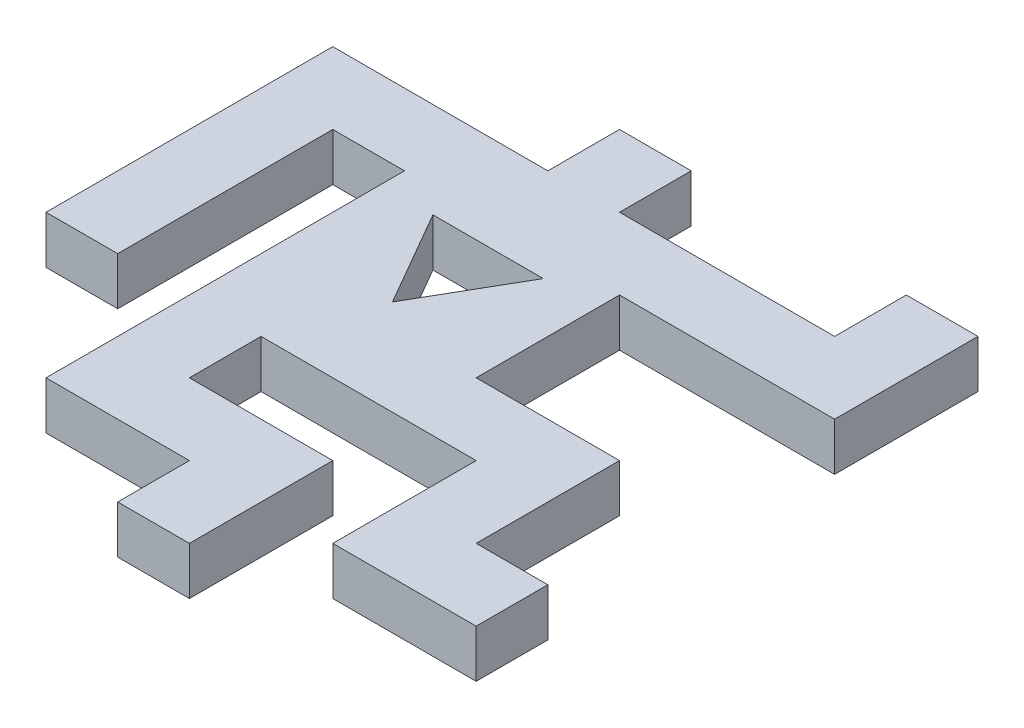
ISO-10303-21;
HEADER;
FILE_DESCRIPTION(('STEP AP214'),'2;1');
FILE_NAME('part.step','',(''),(''),'','','');
FILE_SCHEMA(('AUTOMOTIVE_DESIGN { 1 0 10303 214 1 1 1 1 }'));
ENDSEC;
DATA;
#1=APPLICATION_CONTEXT('core data for automotive mechanical design processes');
#2=APPLICATION_PROTOCOL_DEFINITION('international standard','automotive_design',2000,#1);
#3=PRODUCT_CONTEXT('',#1,'mechanical');
#4=PRODUCT('Part','Part','',(#3));
#5=PRODUCT_RELATED_PRODUCT_CATEGORY('part','',(#4));
#6=PRODUCT_DEFINITION_FORMATION('','',#4);
#7=PRODUCT_DEFINITION_CONTEXT('part definition',#1,'design');
#8=PRODUCT_DEFINITION('design','',#6,#7);
#9=PRODUCT_DEFINITION_SHAPE('','',#8);
#10=(LENGTH_UNIT() NAMED_UNIT(*) SI_UNIT(.MILLI.,.METRE.));
#11=(NAMED_UNIT(*) PLANE_ANGLE_UNIT() SI_UNIT($,.RADIAN.));
#12=(NAMED_UNIT(*) SI_UNIT($,.STERADIAN.) SOLID_ANGLE_UNIT());
#13=UNCERTAINTY_MEASURE_WITH_UNIT(LENGTH_MEASURE(1.E-05),#10,'distance_accuracy_value','');
#14=(GEOMETRIC_REPRESENTATION_CONTEXT(3) GLOBAL_UNCERTAINTY_ASSIGNED_CONTEXT((#13)) GLOBAL_UNIT_ASSIGNED_CONTEXT((#10,
#11,#12)) REPRESENTATION_CONTEXT('',''));
#15=CARTESIAN_POINT('',(0.,0.,0.));
#16=DIRECTION('',(0.,0.,1.));
#17=DIRECTION('',(1.,0.,0.));
#18=AXIS2_PLACEMENT_3D('',#15,#16,#17);
#19=CARTESIAN_POINT('',(-18.75,5.,0.));
#20=DIRECTION('',(-1.,0.,0.));
#21=DIRECTION('',(0.,0.,1.));
#22=AXIS2_PLACEMENT_3D('',#19,#20,#21);
#23=PLANE('',#22);
#24=DIRECTION('',(0.,0.,-1.));
#25=VECTOR('',#24,1.);
#26=CARTESIAN_POINT('',(-18.75,0.,0.));
#27=LINE('',#26,#25);
#28=CARTESIAN_POINT('',(-18.75,0.,15.));
#29=VERTEX_POINT('',#28);
#30=CARTESIAN_POINT('',(-18.75,0.,-7.5));
#31=VERTEX_POINT('',#30);
#32=EDGE_CURVE('E267',#29,#31,#27,.T.);
#33=ORIENTED_EDGE('',*,*,#32,.T.);
#34=DIRECTION('',(0.,-1.,0.));
#35=VECTOR('',#34,1.);
#36=CARTESIAN_POINT('',(-18.75,5.,-7.5));
#37=LINE('',#36,#35);
#38=CARTESIAN_POINT('',(-18.75,5.,-7.5));
#39=VERTEX_POINT('',#38);
#40=EDGE_CURVE('E11',#39,#31,#37,.T.);
#41=ORIENTED_EDGE('',*,*,#40,.F.);
#42=DIRECTION('',(0.,0.,-1.));
#43=VECTOR('',#42,1.);
#44=CARTESIAN_POINT('',(-18.75,5.,0.));
#45=LINE('',#44,#43);
#46=CARTESIAN_POINT('',(-18.75,5.,15.));
#47=VERTEX_POINT('',#46);
#48=EDGE_CURVE('E269',#47,#39,#45,.T.);
#49=ORIENTED_EDGE('',*,*,#48,.F.);
#50=DIRECTION('',(0.,-1.,0.));
#51=VECTOR('',#50,1.);
#52=CARTESIAN_POINT('',(-18.75,5.,15.));
#53=LINE('',#52,#51);
#54=EDGE_CURVE('E341',#47,#29,#53,.T.);
#55=ORIENTED_EDGE('',*,*,#54,.T.);
#56=EDGE_LOOP('',(#33,#41,#49,#55));
#57=FACE_BOUND('',#56,.T.);
#58=ADVANCED_FACE('F39',(#57),#23,.F.);
#59=CARTESIAN_POINT('',(0.,5.,-7.5));
#60=DIRECTION('',(0.,0.,-1.));
#61=DIRECTION('',(-1.,0.,0.));
#62=AXIS2_PLACEMENT_3D('',#59,#60,#61);
#63=PLANE('',#62);
#64=DIRECTION('',(1.,0.,0.));
#65=VECTOR('',#64,1.);
#66=CARTESIAN_POINT('',(0.,0.,-7.5));
#67=LINE('',#66,#65);
#68=CARTESIAN_POINT('',(-11.25,0.,-7.5));
#69=VERTEX_POINT('',#68);
#70=EDGE_CURVE('E344',#31,#69,#67,.T.);
#71=ORIENTED_EDGE('',*,*,#70,.T.);
#72=DIRECTION('',(0.,-1.,0.));
#73=VECTOR('',#72,1.);
#74=CARTESIAN_POINT('',(-11.25,5.,-7.5));
#75=LINE('',#74,#73);
#76=CARTESIAN_POINT('',(-11.25,5.,-7.5));
#77=VERTEX_POINT('',#76);
#78=EDGE_CURVE('E46',#77,#69,#75,.T.);
#79=ORIENTED_EDGE('',*,*,#78,.F.);
#80=DIRECTION('',(1.,0.,0.));
#81=VECTOR('',#80,1.);
#82=CARTESIAN_POINT('',(0.,5.,-7.5));
#83=LINE('',#82,#81);
#84=EDGE_CURVE('E272',#39,#77,#83,.T.);
#85=ORIENTED_EDGE('',*,*,#84,.F.);
#86=ORIENTED_EDGE('',*,*,#40,.T.);
#87=EDGE_LOOP('',(#71,#79,#85,#86));
#88=FACE_BOUND('',#87,.T.);
#89=ADVANCED_FACE('F499',(#88),#63,.F.);
#90=CARTESIAN_POINT('',(-11.25,5.,0.));
#91=DIRECTION('',(1.,0.,0.));
#92=DIRECTION('',(0.,0.,-1.));
#93=AXIS2_PLACEMENT_3D('',#90,#91,#92);
#94=PLANE('',#93);
#95=DIRECTION('',(0.,0.,1.));
#96=VECTOR('',#95,1.);
#97=CARTESIAN_POINT('',(-11.25,0.,0.));
#98=LINE('',#97,#96);
#99=CARTESIAN_POINT('',(-11.25,0.,30.));
#100=VERTEX_POINT('',#99);
#101=EDGE_CURVE('E346',#69,#100,#98,.T.);
#102=ORIENTED_EDGE('',*,*,#101,.T.);
#103=DIRECTION('',(0.,-1.,0.));
#104=VECTOR('',#103,1.);
#105=CARTESIAN_POINT('',(-11.25,5.,30.));
#106=LINE('',#105,#104);
#107=CARTESIAN_POINT('',(-11.25,5.,30.));
#108=VERTEX_POINT('',#107);
#109=EDGE_CURVE('E471',#108,#100,#106,.T.);
#110=ORIENTED_EDGE('',*,*,#109,.F.);
#111=DIRECTION('',(0.,0.,1.));
#112=VECTOR('',#111,1.);
#113=CARTESIAN_POINT('',(-11.25,5.,0.));
#114=LINE('',#113,#112);
#115=EDGE_CURVE('E275',#77,#108,#114,.T.);
#116=ORIENTED_EDGE('',*,*,#115,.F.);
#117=ORIENTED_EDGE('',*,*,#78,.T.);
#118=EDGE_LOOP('',(#102,#110,#116,#117));
#119=FACE_BOUND('',#118,.T.);
#120=ADVANCED_FACE('F478',(#119),#94,.F.);
#121=CARTESIAN_POINT('',(0.,5.,30.));
#122=DIRECTION('',(0.,0.,-1.));
#123=DIRECTION('',(-1.,0.,0.));
#124=AXIS2_PLACEMENT_3D('',#121,#122,#123);
#125=PLANE('',#124);
#126=DIRECTION('',(1.,0.,0.));
#127=VECTOR('',#126,1.);
#128=CARTESIAN_POINT('',(0.,0.,30.));
#129=LINE('',#128,#127);
#130=CARTESIAN_POINT('',(3.75,0.,30.));
#131=VERTEX_POINT('',#130);
#132=EDGE_CURVE('E348',#100,#131,#129,.T.);
#133=ORIENTED_EDGE('',*,*,#132,.T.);
#134=DIRECTION('',(0.,-1.,0.));
#135=VECTOR('',#134,1.);
#136=CARTESIAN_POINT('',(3.75,5.,30.));
#137=LINE('',#136,#135);
#138=CARTESIAN_POINT('',(3.75,5.,30.));
#139=VERTEX_POINT('',#138);
#140=EDGE_CURVE('E468',#139,#131,#137,.T.);
#141=ORIENTED_EDGE('',*,*,#140,.F.);
#142=DIRECTION('',(1.,0.,0.));
#143=VECTOR('',#142,1.);
#144=CARTESIAN_POINT('',(0.,5.,30.));
#145=LINE('',#144,#143);
#146=EDGE_CURVE('E277',#108,#139,#145,.T.);
#147=ORIENTED_EDGE('',*,*,#146,.F.);
#148=ORIENTED_EDGE('',*,*,#109,.T.);
#149=EDGE_LOOP('',(#133,#141,#147,#148));
#150=FACE_BOUND('',#149,.T.);
#151=ADVANCED_FACE('F487',(#150),#125,.F.);
#152=CARTESIAN_POINT('',(3.75,5.,0.));
#153=DIRECTION('',(1.,0.,0.));
#154=DIRECTION('',(0.,0.,-1.));
#155=AXIS2_PLACEMENT_3D('',#152,#153,#154);
#156=PLANE('',#155);
#157=DIRECTION('',(0.,0.,1.));
#158=VECTOR('',#157,1.);
#159=CARTESIAN_POINT('',(3.75,0.,0.));
#160=LINE('',#159,#158);
#161=CARTESIAN_POINT('',(3.75,0.,37.5));
#162=VERTEX_POINT('',#161);
#163=EDGE_CURVE('E350',#131,#162,#160,.T.);
#164=ORIENTED_EDGE('',*,*,#163,.T.);
#165=DIRECTION('',(0.,-1.,0.));
#166=VECTOR('',#165,1.);
#167=CARTESIAN_POINT('',(3.75,5.,37.5));
#168=LINE('',#167,#166);
#169=CARTESIAN_POINT('',(3.75,5.,37.5));
#170=VERTEX_POINT('',#169);
#171=EDGE_CURVE('E465',#170,#162,#168,.T.);
#172=ORIENTED_EDGE('',*,*,#171,.F.);
#173=DIRECTION('',(0.,0.,1.));
#174=VECTOR('',#173,1.);
#175=CARTESIAN_POINT('',(3.75,5.,0.));
#176=LINE('',#175,#174);
#177=EDGE_CURVE('E279',#139,#170,#176,.T.);
#178=ORIENTED_EDGE('',*,*,#177,.F.);
#179=ORIENTED_EDGE('',*,*,#140,.T.);
#180=EDGE_LOOP('',(#164,#172,#178,#179));
#181=FACE_BOUND('',#180,.T.);
#182=ADVANCED_FACE('F491',(#181),#156,.F.);
#183=CARTESIAN_POINT('',(0.,5.,37.5));
#184=DIRECTION('',(0.,0.,-1.));
#185=DIRECTION('',(-1.,0.,0.));
#186=AXIS2_PLACEMENT_3D('',#183,#184,#185);
#187=PLANE('',#186);
#188=DIRECTION('',(1.,0.,0.));
#189=VECTOR('',#188,1.);
#190=CARTESIAN_POINT('',(0.,0.,37.5));
#191=LINE('',#190,#189);
#192=CARTESIAN_POINT('',(11.25,0.,37.5));
#193=VERTEX_POINT('',#192);
#194=EDGE_CURVE('E352',#162,#193,#191,.T.);
#195=ORIENTED_EDGE('',*,*,#194,.T.);
#196=DIRECTION('',(0.,-1.,0.));
#197=VECTOR('',#196,1.);
#198=CARTESIAN_POINT('',(11.25,5.,37.5));
#199=LINE('',#198,#197);
#200=CARTESIAN_POINT('',(11.25,5.,37.5));
#201=VERTEX_POINT('',#200);
#202=EDGE_CURVE('E462',#201,#193,#199,.T.);
#203=ORIENTED_EDGE('',*,*,#202,.F.);
#204=DIRECTION('',(1.,0.,0.));
#205=VECTOR('',#204,1.);
#206=CARTESIAN_POINT('',(0.,5.,37.5));
#207=LINE('',#206,#205);
#208=EDGE_CURVE('E281',#170,#201,#207,.T.);
#209=ORIENTED_EDGE('',*,*,#208,.F.);
#210=ORIENTED_EDGE('',*,*,#171,.T.);
#211=EDGE_LOOP('',(#195,#203,#209,#210));
#212=FACE_BOUND('',#211,.T.);
#213=ADVANCED_FACE('F597',(#212),#187,.F.);
#214=CARTESIAN_POINT('',(11.25,5.,0.));
#215=DIRECTION('',(-1.,0.,0.));
#216=DIRECTION('',(0.,0.,1.));
#217=AXIS2_PLACEMENT_3D('',#214,#215,#216);
#218=PLANE('',#217);
#219=DIRECTION('',(0.,0.,-1.));
#220=VECTOR('',#219,1.);
#221=CARTESIAN_POINT('',(11.25,0.,0.));
#222=LINE('',#221,#220);
#223=CARTESIAN_POINT('',(11.25,0.,22.5));
#224=VERTEX_POINT('',#223);
#225=EDGE_CURVE('E354',#193,#224,#222,.T.);
#226=ORIENTED_EDGE('',*,*,#225,.T.);
#227=DIRECTION('',(0.,-1.,0.));
#228=VECTOR('',#227,1.);
#229=CARTESIAN_POINT('',(11.25,5.,22.5));
#230=LINE('',#229,#228);
#231=CARTESIAN_POINT('',(11.25,5.,22.5));
#232=VERTEX_POINT('',#231);
#233=EDGE_CURVE('E459',#232,#224,#230,.T.);
#234=ORIENTED_EDGE('',*,*,#233,.F.);
#235=DIRECTION('',(0.,0.,-1.));
#236=VECTOR('',#235,1.);
#237=CARTESIAN_POINT('',(11.25,5.,0.));
#238=LINE('',#237,#236);
#239=EDGE_CURVE('E283',#201,#232,#238,.T.);
#240=ORIENTED_EDGE('',*,*,#239,.F.);
#241=ORIENTED_EDGE('',*,*,#202,.T.);
#242=EDGE_LOOP('',(#226,#234,#240,#241));
#243=FACE_BOUND('',#242,.T.);
#244=ADVANCED_FACE('F595',(#243),#218,.F.);
#245=CARTESIAN_POINT('',(0.,5.,22.5));
#246=DIRECTION('',(0.,0.,1.));
#247=DIRECTION('',(1.,0.,0.));
#248=AXIS2_PLACEMENT_3D('',#245,#246,#247);
#249=PLANE('',#248);
#250=DIRECTION('',(-1.,0.,0.));
#251=VECTOR('',#250,1.);
#252=CARTESIAN_POINT('',(0.,0.,22.5));
#253=LINE('',#252,#251);
#254=CARTESIAN_POINT('',(-3.75,0.,22.5));
#255=VERTEX_POINT('',#254);
#256=EDGE_CURVE('E356',#224,#255,#253,.T.);
#257=ORIENTED_EDGE('',*,*,#256,.T.);
#258=DIRECTION('',(0.,-1.,0.));
#259=VECTOR('',#258,1.);
#260=CARTESIAN_POINT('',(-3.75,5.,22.5));
#261=LINE('',#260,#259);
#262=CARTESIAN_POINT('',(-3.75,5.,22.5));
#263=VERTEX_POINT('',#262);
#264=EDGE_CURVE('E456',#263,#255,#261,.T.);
#265=ORIENTED_EDGE('',*,*,#264,.F.);
#266=DIRECTION('',(-1.,0.,0.));
#267=VECTOR('',#266,1.);
#268=CARTESIAN_POINT('',(0.,5.,22.5));
#269=LINE('',#268,#267);
#270=EDGE_CURVE('E285',#232,#263,#269,.T.);
#271=ORIENTED_EDGE('',*,*,#270,.F.);
#272=ORIENTED_EDGE('',*,*,#233,.T.);
#273=EDGE_LOOP('',(#257,#265,#271,#272));
#274=FACE_BOUND('',#273,.T.);
#275=ADVANCED_FACE('F590',(#274),#249,.F.);
#276=CARTESIAN_POINT('',(-3.75,5.,0.));
#277=DIRECTION('',(-1.,0.,0.));
#278=DIRECTION('',(0.,0.,1.));
#279=AXIS2_PLACEMENT_3D('',#276,#277,#278);
#280=PLANE('',#279);
#281=DIRECTION('',(0.,0.,-1.));
#282=VECTOR('',#281,1.);
#283=CARTESIAN_POINT('',(-3.75,0.,0.));
#284=LINE('',#283,#282);
#285=CARTESIAN_POINT('',(-3.75,0.,15.));
#286=VERTEX_POINT('',#285);
#287=EDGE_CURVE('E358',#255,#286,#284,.T.);
#288=ORIENTED_EDGE('',*,*,#287,.T.);
#289=DIRECTION('',(0.,-1.,0.));
#290=VECTOR('',#289,1.);
#291=CARTESIAN_POINT('',(-3.75,5.,15.));
#292=LINE('',#291,#290);
#293=CARTESIAN_POINT('',(-3.75,5.,15.));
#294=VERTEX_POINT('',#293);
#295=EDGE_CURVE('E453',#294,#286,#292,.T.);
#296=ORIENTED_EDGE('',*,*,#295,.F.);
#297=DIRECTION('',(0.,0.,-1.));
#298=VECTOR('',#297,1.);
#299=CARTESIAN_POINT('',(-3.75,5.,0.));
#300=LINE('',#299,#298);
#301=EDGE_CURVE('E287',#263,#294,#300,.T.);
#302=ORIENTED_EDGE('',*,*,#301,.F.);
#303=ORIENTED_EDGE('',*,*,#264,.T.);
#304=EDGE_LOOP('',(#288,#296,#302,#303));
#305=FACE_BOUND('',#304,.T.);
#306=ADVANCED_FACE('F585',(#305),#280,.F.);
#307=CARTESIAN_POINT('',(0.,5.,15.));
#308=DIRECTION('',(0.,0.,-1.));
#309=DIRECTION('',(-1.,0.,0.));
#310=AXIS2_PLACEMENT_3D('',#307,#308,#309);
#311=PLANE('',#310);
#312=DIRECTION('',(1.,0.,0.));
#313=VECTOR('',#312,1.);
#314=CARTESIAN_POINT('',(0.,0.,15.));
#315=LINE('',#314,#313);
#316=CARTESIAN_POINT('',(18.75,0.,15.));
#317=VERTEX_POINT('',#316);
#318=EDGE_CURVE('E360',#286,#317,#315,.T.);
#319=ORIENTED_EDGE('',*,*,#318,.T.);
#320=DIRECTION('',(0.,-1.,0.));
#321=VECTOR('',#320,1.);
#322=CARTESIAN_POINT('',(18.75,5.,15.));
#323=LINE('',#322,#321);
#324=CARTESIAN_POINT('',(18.75,5.,15.));
#325=VERTEX_POINT('',#324);
#326=EDGE_CURVE('E451',#325,#317,#323,.T.);
#327=ORIENTED_EDGE('',*,*,#326,.F.);
#328=DIRECTION('',(1.,0.,0.));
#329=VECTOR('',#328,1.);
#330=CARTESIAN_POINT('',(0.,5.,15.));
#331=LINE('',#330,#329);
#332=EDGE_CURVE('E289',#294,#325,#331,.T.);
#333=ORIENTED_EDGE('',*,*,#332,.F.);
#334=ORIENTED_EDGE('',*,*,#295,.T.);
#335=EDGE_LOOP('',(#319,#327,#333,#334));
#336=FACE_BOUND('',#335,.T.);
#337=ADVANCED_FACE('F581',(#336),#311,.F.);
#338=CARTESIAN_POINT('',(18.75,5.,0.));
#339=DIRECTION('',(-1.,0.,0.));
#340=DIRECTION('',(0.,0.,1.));
#341=AXIS2_PLACEMENT_3D('',#338,#339,#340);
#342=PLANE('',#341);
#343=DIRECTION('',(0.,0.,-1.));
#344=VECTOR('',#343,1.);
#345=CARTESIAN_POINT('',(18.75,0.,0.));
#346=LINE('',#345,#344);
#347=CARTESIAN_POINT('',(18.75,0.,30.));
#348=VERTEX_POINT('',#347);
#349=EDGE_CURVE('E363',#348,#317,#346,.T.);
#350=ORIENTED_EDGE('',*,*,#349,.F.);
#351=DIRECTION('',(0.,-1.,0.));
#352=VECTOR('',#351,1.);
#353=CARTESIAN_POINT('',(18.75,5.,30.));
#354=LINE('',#353,#352);
#355=CARTESIAN_POINT('',(18.75,5.,30.));
#356=VERTEX_POINT('',#355);
#357=EDGE_CURVE('E449',#356,#348,#354,.T.);
#358=ORIENTED_EDGE('',*,*,#357,.F.);
#359=DIRECTION('',(0.,0.,-1.));
#360=VECTOR('',#359,1.);
#361=CARTESIAN_POINT('',(18.75,5.,0.));
#362=LINE('',#361,#360);
#363=EDGE_CURVE('E291',#356,#325,#362,.T.);
#364=ORIENTED_EDGE('',*,*,#363,.T.);
#365=ORIENTED_EDGE('',*,*,#326,.T.);
#366=EDGE_LOOP('',(#350,#358,#364,#365));
#367=FACE_BOUND('',#366,.T.);
#368=ADVANCED_FACE('F576',(#367),#342,.T.);
#369=CARTESIAN_POINT('',(0.,5.,30.));
#370=DIRECTION('',(0.,0.,1.));
#371=DIRECTION('',(1.,0.,0.));
#372=AXIS2_PLACEMENT_3D('',#369,#370,#371);
#373=PLANE('',#372);
#374=DIRECTION('',(-1.,0.,0.));
#375=VECTOR('',#374,1.);
#376=CARTESIAN_POINT('',(0.,0.,30.));
#377=LINE('',#376,#375);
#378=CARTESIAN_POINT('',(33.75,0.,30.));
#379=VERTEX_POINT('',#378);
#380=EDGE_CURVE('E366',#379,#348,#377,.T.);
#381=ORIENTED_EDGE('',*,*,#380,.F.);
#382=DIRECTION('',(0.,-1.,0.));
#383=VECTOR('',#382,1.);
#384=CARTESIAN_POINT('',(33.75,5.,30.));
#385=LINE('',#384,#383);
#386=CARTESIAN_POINT('',(33.75,5.,30.));
#387=VERTEX_POINT('',#386);
#388=EDGE_CURVE('E447',#387,#379,#385,.T.);
#389=ORIENTED_EDGE('',*,*,#388,.F.);
#390=DIRECTION('',(-1.,0.,0.));
#391=VECTOR('',#390,1.);
#392=CARTESIAN_POINT('',(0.,5.,30.));
#393=LINE('',#392,#391);
#394=EDGE_CURVE('E294',#387,#356,#393,.T.);
#395=ORIENTED_EDGE('',*,*,#394,.T.);
#396=ORIENTED_EDGE('',*,*,#357,.T.);
#397=EDGE_LOOP('',(#381,#389,#395,#396));
#398=FACE_BOUND('',#397,.T.);
#399=ADVANCED_FACE('F571',(#398),#373,.T.);
#400=CARTESIAN_POINT('',(33.75,5.,0.));
#401=DIRECTION('',(1.,0.,0.));
#402=DIRECTION('',(0.,0.,-1.));
#403=AXIS2_PLACEMENT_3D('',#400,#401,#402);
#404=PLANE('',#403);
#405=DIRECTION('',(0.,0.,1.));
#406=VECTOR('',#405,1.);
#407=CARTESIAN_POINT('',(33.75,0.,0.));
#408=LINE('',#407,#406);
#409=CARTESIAN_POINT('',(33.75,0.,22.5));
#410=VERTEX_POINT('',#409);
#411=EDGE_CURVE('E369',#410,#379,#408,.T.);
#412=ORIENTED_EDGE('',*,*,#411,.F.);
#413=DIRECTION('',(0.,-1.,0.));
#414=VECTOR('',#413,1.);
#415=CARTESIAN_POINT('',(33.75,5.,22.5));
#416=LINE('',#415,#414);
#417=CARTESIAN_POINT('',(33.75,5.,22.5));
#418=VERTEX_POINT('',#417);
#419=EDGE_CURVE('E445',#418,#410,#416,.T.);
#420=ORIENTED_EDGE('',*,*,#419,.F.);
#421=DIRECTION('',(0.,0.,1.));
#422=VECTOR('',#421,1.);
#423=CARTESIAN_POINT('',(33.75,5.,0.));
#424=LINE('',#423,#422);
#425=EDGE_CURVE('E297',#418,#387,#424,.T.);
#426=ORIENTED_EDGE('',*,*,#425,.T.);
#427=ORIENTED_EDGE('',*,*,#388,.T.);
#428=EDGE_LOOP('',(#412,#420,#426,#427));
#429=FACE_BOUND('',#428,.T.);
#430=ADVANCED_FACE('F567',(#429),#404,.T.);
#431=CARTESIAN_POINT('',(0.,5.,22.5));
#432=DIRECTION('',(0.,0.,-1.));
#433=DIRECTION('',(-1.,0.,0.));
#434=AXIS2_PLACEMENT_3D('',#431,#432,#433);
#435=PLANE('',#434);
#436=DIRECTION('',(1.,0.,0.));
#437=VECTOR('',#436,1.);
#438=CARTESIAN_POINT('',(0.,0.,22.5));
#439=LINE('',#438,#437);
#440=CARTESIAN_POINT('',(26.25,0.,22.5));
#441=VERTEX_POINT('',#440);
#442=EDGE_CURVE('E372',#441,#410,#439,.T.);
#443=ORIENTED_EDGE('',*,*,#442,.F.);
#444=DIRECTION('',(0.,-1.,0.));
#445=VECTOR('',#444,1.);
#446=CARTESIAN_POINT('',(26.25,5.,22.5));
#447=LINE('',#446,#445);
#448=CARTESIAN_POINT('',(26.25,5.,22.5));
#449=VERTEX_POINT('',#448);
#450=EDGE_CURVE('E443',#449,#441,#447,.T.);
#451=ORIENTED_EDGE('',*,*,#450,.F.);
#452=DIRECTION('',(1.,0.,0.));
#453=VECTOR('',#452,1.);
#454=CARTESIAN_POINT('',(0.,5.,22.5));
#455=LINE('',#454,#453);
#456=EDGE_CURVE('E300',#449,#418,#455,.T.);
#457=ORIENTED_EDGE('',*,*,#456,.T.);
#458=ORIENTED_EDGE('',*,*,#419,.T.);
#459=EDGE_LOOP('',(#443,#451,#457,#458));
#460=FACE_BOUND('',#459,.T.);
#461=ADVANCED_FACE('F563',(#460),#435,.T.);
#462=CARTESIAN_POINT('',(26.25,5.,0.));
#463=DIRECTION('',(1.,0.,0.));
#464=DIRECTION('',(0.,0.,-1.));
#465=AXIS2_PLACEMENT_3D('',#462,#463,#464);
#466=PLANE('',#465);
#467=DIRECTION('',(0.,0.,1.));
#468=VECTOR('',#467,1.);
#469=CARTESIAN_POINT('',(26.25,0.,0.));
#470=LINE('',#469,#468);
#471=CARTESIAN_POINT('',(26.25,0.,7.49999999999999));
#472=VERTEX_POINT('',#471);
#473=EDGE_CURVE('E375',#472,#441,#470,.T.);
#474=ORIENTED_EDGE('',*,*,#473,.F.);
#475=DIRECTION('',(0.,-1.,0.));
#476=VECTOR('',#475,1.);
#477=CARTESIAN_POINT('',(26.25,5.,7.49999999999999));
#478=LINE('',#477,#476);
#479=CARTESIAN_POINT('',(26.25,5.,7.49999999999999));
#480=VERTEX_POINT('',#479);
#481=EDGE_CURVE('E441',#480,#472,#478,.T.);
#482=ORIENTED_EDGE('',*,*,#481,.F.);
#483=DIRECTION('',(0.,0.,1.));
#484=VECTOR('',#483,1.);
#485=CARTESIAN_POINT('',(26.25,5.,0.));
#486=LINE('',#485,#484);
#487=EDGE_CURVE('E303',#480,#449,#486,.T.);
#488=ORIENTED_EDGE('',*,*,#487,.T.);
#489=ORIENTED_EDGE('',*,*,#450,.T.);
#490=EDGE_LOOP('',(#474,#482,#488,#489));
#491=FACE_BOUND('',#490,.T.);
#492=ADVANCED_FACE('F559',(#491),#466,.T.);
#493=CARTESIAN_POINT('',(0.,5.,7.49999999999999));
#494=DIRECTION('',(0.,0.,-1.));
#495=DIRECTION('',(-1.,0.,0.));
#496=AXIS2_PLACEMENT_3D('',#493,#494,#495);
#497=PLANE('',#496);
#498=DIRECTION('',(1.,0.,0.));
#499=VECTOR('',#498,1.);
#500=CARTESIAN_POINT('',(0.,0.,7.49999999999999));
#501=LINE('',#500,#499);
#502=CARTESIAN_POINT('',(11.25,0.,7.49999999999999));
#503=VERTEX_POINT('',#502);
#504=EDGE_CURVE('E378',#503,#472,#501,.T.);
#505=ORIENTED_EDGE('',*,*,#504,.F.);
#506=DIRECTION('',(0.,-1.,0.));
#507=VECTOR('',#506,1.);
#508=CARTESIAN_POINT('',(11.25,5.,7.49999999999999));
#509=LINE('',#508,#507);
#510=CARTESIAN_POINT('',(11.25,5.,7.49999999999999));
#511=VERTEX_POINT('',#510);
#512=EDGE_CURVE('E439',#511,#503,#509,.T.);
#513=ORIENTED_EDGE('',*,*,#512,.F.);
#514=DIRECTION('',(1.,0.,0.));
#515=VECTOR('',#514,1.);
#516=CARTESIAN_POINT('',(0.,5.,7.49999999999999));
#517=LINE('',#516,#515);
#518=EDGE_CURVE('E306',#511,#480,#517,.T.);
#519=ORIENTED_EDGE('',*,*,#518,.T.);
#520=ORIENTED_EDGE('',*,*,#481,.T.);
#521=EDGE_LOOP('',(#505,#513,#519,#520));
#522=FACE_BOUND('',#521,.T.);
#523=ADVANCED_FACE('F555',(#522),#497,.T.);
#524=CARTESIAN_POINT('',(11.25,5.,0.));
#525=DIRECTION('',(1.,0.,0.));
#526=DIRECTION('',(0.,0.,-1.));
#527=AXIS2_PLACEMENT_3D('',#524,#525,#526);
#528=PLANE('',#527);
#529=DIRECTION('',(0.,0.,1.));
#530=VECTOR('',#529,1.);
#531=CARTESIAN_POINT('',(11.25,0.,0.));
#532=LINE('',#531,#530);
#533=CARTESIAN_POINT('',(11.25,0.,-7.5));
#534=VERTEX_POINT('',#533);
#535=EDGE_CURVE('E381',#534,#503,#532,.T.);
#536=ORIENTED_EDGE('',*,*,#535,.F.);
#537=DIRECTION('',(0.,-1.,0.));
#538=VECTOR('',#537,1.);
#539=CARTESIAN_POINT('',(11.25,5.,-7.5));
#540=LINE('',#539,#538);
#541=CARTESIAN_POINT('',(11.25,5.,-7.5));
#542=VERTEX_POINT('',#541);
#543=EDGE_CURVE('E437',#542,#534,#540,.T.);
#544=ORIENTED_EDGE('',*,*,#543,.F.);
#545=DIRECTION('',(0.,0.,1.));
#546=VECTOR('',#545,1.);
#547=CARTESIAN_POINT('',(11.25,5.,0.));
#548=LINE('',#547,#546);
#549=EDGE_CURVE('E309',#542,#511,#548,.T.);
#550=ORIENTED_EDGE('',*,*,#549,.T.);
#551=ORIENTED_EDGE('',*,*,#512,.T.);
#552=EDGE_LOOP('',(#536,#544,#550,#551));
#553=FACE_BOUND('',#552,.T.);
#554=ADVANCED_FACE('F551',(#553),#528,.T.);
#555=CARTESIAN_POINT('',(0.,5.,-7.5));
#556=DIRECTION('',(0.,0.,1.));
#557=DIRECTION('',(1.,0.,0.));
#558=AXIS2_PLACEMENT_3D('',#555,#556,#557);
#559=PLANE('',#558);
#560=DIRECTION('',(-1.,0.,0.));
#561=VECTOR('',#560,1.);
#562=CARTESIAN_POINT('',(0.,0.,-7.5));
#563=LINE('',#562,#561);
#564=CARTESIAN_POINT('',(33.75,0.,-7.5));
#565=VERTEX_POINT('',#564);
#566=EDGE_CURVE('E384',#565,#534,#563,.T.);
#567=ORIENTED_EDGE('',*,*,#566,.F.);
#568=DIRECTION('',(0.,-1.,0.));
#569=VECTOR('',#568,1.);
#570=CARTESIAN_POINT('',(33.75,5.,-7.5));
#571=LINE('',#570,#569);
#572=CARTESIAN_POINT('',(33.75,5.,-7.5));
#573=VERTEX_POINT('',#572);
#574=EDGE_CURVE('E435',#573,#565,#571,.T.);
#575=ORIENTED_EDGE('',*,*,#574,.F.);
#576=DIRECTION('',(-1.,0.,0.));
#577=VECTOR('',#576,1.);
#578=CARTESIAN_POINT('',(0.,5.,-7.5));
#579=LINE('',#578,#577);
#580=EDGE_CURVE('E312',#573,#542,#579,.T.);
#581=ORIENTED_EDGE('',*,*,#580,.T.);
#582=ORIENTED_EDGE('',*,*,#543,.T.);
#583=EDGE_LOOP('',(#567,#575,#581,#582));
#584=FACE_BOUND('',#583,.T.);
#585=ADVANCED_FACE('F547',(#584),#559,.T.);
#586=CARTESIAN_POINT('',(33.75,5.,0.));
#587=DIRECTION('',(1.,0.,0.));
#588=DIRECTION('',(0.,0.,-1.));
#589=AXIS2_PLACEMENT_3D('',#586,#587,#588);
#590=PLANE('',#589);
#591=DIRECTION('',(0.,0.,1.));
#592=VECTOR('',#591,1.);
#593=CARTESIAN_POINT('',(33.75,0.,0.));
#594=LINE('',#593,#592);
#595=CARTESIAN_POINT('',(33.75,0.,-22.5));
#596=VERTEX_POINT('',#595);
#597=EDGE_CURVE('E387',#596,#565,#594,.T.);
#598=ORIENTED_EDGE('',*,*,#597,.F.);
#599=DIRECTION('',(0.,-1.,0.));
#600=VECTOR('',#599,1.);
#601=CARTESIAN_POINT('',(33.75,5.,-22.5));
#602=LINE('',#601,#600);
#603=CARTESIAN_POINT('',(33.75,5.,-22.5));
#604=VERTEX_POINT('',#603);
#605=EDGE_CURVE('E433',#604,#596,#602,.T.);
#606=ORIENTED_EDGE('',*,*,#605,.F.);
#607=DIRECTION('',(0.,0.,1.));
#608=VECTOR('',#607,1.);
#609=CARTESIAN_POINT('',(33.75,5.,0.));
#610=LINE('',#609,#608);
#611=EDGE_CURVE('E315',#604,#573,#610,.T.);
#612=ORIENTED_EDGE('',*,*,#611,.T.);
#613=ORIENTED_EDGE('',*,*,#574,.T.);
#614=EDGE_LOOP('',(#598,#606,#612,#613));
#615=FACE_BOUND('',#614,.T.);
#616=ADVANCED_FACE('F543',(#615),#590,.T.);
#617=CARTESIAN_POINT('',(0.,5.,-22.5));
#618=DIRECTION('',(0.,0.,-1.));
#619=DIRECTION('',(-1.,0.,0.));
#620=AXIS2_PLACEMENT_3D('',#617,#618,#619);
#621=PLANE('',#620);
#622=DIRECTION('',(1.,0.,0.));
#623=VECTOR('',#622,1.);
#624=CARTESIAN_POINT('',(0.,0.,-22.5));
#625=LINE('',#624,#623);
#626=CARTESIAN_POINT('',(26.25,0.,-22.5));
#627=VERTEX_POINT('',#626);
#628=EDGE_CURVE('E390',#627,#596,#625,.T.);
#629=ORIENTED_EDGE('',*,*,#628,.F.);
#630=DIRECTION('',(0.,-1.,0.));
#631=VECTOR('',#630,1.);
#632=CARTESIAN_POINT('',(26.25,5.,-22.5));
#633=LINE('',#632,#631);
#634=CARTESIAN_POINT('',(26.25,5.,-22.5));
#635=VERTEX_POINT('',#634);
#636=EDGE_CURVE('E431',#635,#627,#633,.T.);
#637=ORIENTED_EDGE('',*,*,#636,.F.);
#638=DIRECTION('',(1.,0.,0.));
#639=VECTOR('',#638,1.);
#640=CARTESIAN_POINT('',(0.,5.,-22.5));
#641=LINE('',#640,#639);
#642=EDGE_CURVE('E318',#635,#604,#641,.T.);
#643=ORIENTED_EDGE('',*,*,#642,.T.);
#644=ORIENTED_EDGE('',*,*,#605,.T.);
#645=EDGE_LOOP('',(#629,#637,#643,#644));
#646=FACE_BOUND('',#645,.T.);
#647=ADVANCED_FACE('F539',(#646),#621,.T.);
#648=CARTESIAN_POINT('',(26.25,5.,0.));
#649=DIRECTION('',(-1.,0.,0.));
#650=DIRECTION('',(0.,0.,1.));
#651=AXIS2_PLACEMENT_3D('',#648,#649,#650);
#652=PLANE('',#651);
#653=DIRECTION('',(0.,0.,-1.));
#654=VECTOR('',#653,1.);
#655=CARTESIAN_POINT('',(26.25,0.,0.));
#656=LINE('',#655,#654);
#657=CARTESIAN_POINT('',(26.25,0.,-15.));
#658=VERTEX_POINT('',#657);
#659=EDGE_CURVE('E393',#658,#627,#656,.T.);
#660=ORIENTED_EDGE('',*,*,#659,.F.);
#661=DIRECTION('',(0.,-1.,0.));
#662=VECTOR('',#661,1.);
#663=CARTESIAN_POINT('',(26.25,5.,-15.));
#664=LINE('',#663,#662);
#665=CARTESIAN_POINT('',(26.25,5.,-15.));
#666=VERTEX_POINT('',#665);
#667=EDGE_CURVE('E429',#666,#658,#664,.T.);
#668=ORIENTED_EDGE('',*,*,#667,.F.);
#669=DIRECTION('',(0.,0.,-1.));
#670=VECTOR('',#669,1.);
#671=CARTESIAN_POINT('',(26.25,5.,0.));
#672=LINE('',#671,#670);
#673=EDGE_CURVE('E321',#666,#635,#672,.T.);
#674=ORIENTED_EDGE('',*,*,#673,.T.);
#675=ORIENTED_EDGE('',*,*,#636,.T.);
#676=EDGE_LOOP('',(#660,#668,#674,#675));
#677=FACE_BOUND('',#676,.T.);
#678=ADVANCED_FACE('F535',(#677),#652,.T.);
#679=CARTESIAN_POINT('',(0.,5.,-15.));
#680=DIRECTION('',(0.,0.,-1.));
#681=DIRECTION('',(-1.,0.,0.));
#682=AXIS2_PLACEMENT_3D('',#679,#680,#681);
#683=PLANE('',#682);
#684=DIRECTION('',(1.,0.,0.));
#685=VECTOR('',#684,1.);
#686=CARTESIAN_POINT('',(0.,0.,-15.));
#687=LINE('',#686,#685);
#688=CARTESIAN_POINT('',(3.75,0.,-15.));
#689=VERTEX_POINT('',#688);
#690=EDGE_CURVE('E396',#689,#658,#687,.T.);
#691=ORIENTED_EDGE('',*,*,#690,.F.);
#692=DIRECTION('',(0.,-1.,0.));
#693=VECTOR('',#692,1.);
#694=CARTESIAN_POINT('',(3.75,5.,-15.));
#695=LINE('',#694,#693);
#696=CARTESIAN_POINT('',(3.75,5.,-15.));
#697=VERTEX_POINT('',#696);
#698=EDGE_CURVE('E427',#697,#689,#695,.T.);
#699=ORIENTED_EDGE('',*,*,#698,.F.);
#700=DIRECTION('',(1.,0.,0.));
#701=VECTOR('',#700,1.);
#702=CARTESIAN_POINT('',(0.,5.,-15.));
#703=LINE('',#702,#701);
#704=EDGE_CURVE('E324',#697,#666,#703,.T.);
#705=ORIENTED_EDGE('',*,*,#704,.T.);
#706=ORIENTED_EDGE('',*,*,#667,.T.);
#707=EDGE_LOOP('',(#691,#699,#705,#706));
#708=FACE_BOUND('',#707,.T.);
#709=ADVANCED_FACE('F529',(#708),#683,.T.);
#710=CARTESIAN_POINT('',(3.75,5.,0.));
#711=DIRECTION('',(-1.,0.,0.));
#712=DIRECTION('',(0.,0.,1.));
#713=AXIS2_PLACEMENT_3D('',#710,#711,#712);
#714=PLANE('',#713);
#715=DIRECTION('',(0.,0.,-1.));
#716=VECTOR('',#715,1.);
#717=CARTESIAN_POINT('',(3.75,0.,0.));
#718=LINE('',#717,#716);
#719=CARTESIAN_POINT('',(3.75,0.,-22.5));
#720=VERTEX_POINT('',#719);
#721=EDGE_CURVE('E399',#689,#720,#718,.T.);
#722=ORIENTED_EDGE('',*,*,#721,.T.);
#723=DIRECTION('',(0.,-1.,0.));
#724=VECTOR('',#723,1.);
#725=CARTESIAN_POINT('',(3.75,5.,-22.5));
#726=LINE('',#725,#724);
#727=CARTESIAN_POINT('',(3.75,5.,-22.5));
#728=VERTEX_POINT('',#727);
#729=EDGE_CURVE('E425',#728,#720,#726,.T.);
#730=ORIENTED_EDGE('',*,*,#729,.F.);
#731=DIRECTION('',(0.,0.,-1.));
#732=VECTOR('',#731,1.);
#733=CARTESIAN_POINT('',(3.75,5.,0.));
#734=LINE('',#733,#732);
#735=EDGE_CURVE('E327',#697,#728,#734,.T.);
#736=ORIENTED_EDGE('',*,*,#735,.F.);
#737=ORIENTED_EDGE('',*,*,#698,.T.);
#738=EDGE_LOOP('',(#722,#730,#736,#737));
#739=FACE_BOUND('',#738,.T.);
#740=ADVANCED_FACE('F757',(#739),#714,.F.);
#741=CARTESIAN_POINT('',(0.,5.,-22.5));
#742=DIRECTION('',(0.,0.,-1.));
#743=DIRECTION('',(-1.,0.,0.));
#744=AXIS2_PLACEMENT_3D('',#741,#742,#743);
#745=PLANE('',#744);
#746=DIRECTION('',(1.,0.,0.));
#747=VECTOR('',#746,1.);
#748=CARTESIAN_POINT('',(0.,0.,-22.5));
#749=LINE('',#748,#747);
#750=CARTESIAN_POINT('',(-3.75,0.,-22.5));
#751=VERTEX_POINT('',#750);
#752=EDGE_CURVE('E402',#751,#720,#749,.T.);
#753=ORIENTED_EDGE('',*,*,#752,.F.);
#754=DIRECTION('',(0.,-1.,0.));
#755=VECTOR('',#754,1.);
#756=CARTESIAN_POINT('',(-3.75,5.,-22.5));
#757=LINE('',#756,#755);
#758=CARTESIAN_POINT('',(-3.75,5.,-22.5));
#759=VERTEX_POINT('',#758);
#760=EDGE_CURVE('E423',#759,#751,#757,.T.);
#761=ORIENTED_EDGE('',*,*,#760,.F.);
#762=DIRECTION('',(1.,0.,0.));
#763=VECTOR('',#762,1.);
#764=CARTESIAN_POINT('',(0.,5.,-22.5));
#765=LINE('',#764,#763);
#766=EDGE_CURVE('E329',#759,#728,#765,.T.);
#767=ORIENTED_EDGE('',*,*,#766,.T.);
#768=ORIENTED_EDGE('',*,*,#729,.T.);
#769=EDGE_LOOP('',(#753,#761,#767,#768));
#770=FACE_BOUND('',#769,.T.);
#771=ADVANCED_FACE('F523',(#770),#745,.T.);
#772=CARTESIAN_POINT('',(-3.75000000000001,5.,0.));
#773=DIRECTION('',(-1.,0.,0.));
#774=DIRECTION('',(0.,0.,1.));
#775=AXIS2_PLACEMENT_3D('',#772,#773,#774);
#776=PLANE('',#775);
#777=DIRECTION('',(0.,0.,-1.));
#778=VECTOR('',#777,1.);
#779=CARTESIAN_POINT('',(-3.75000000000001,0.,0.));
#780=LINE('',#779,#778);
#781=CARTESIAN_POINT('',(-3.75,0.,-15.));
#782=VERTEX_POINT('',#781);
#783=EDGE_CURVE('E405',#782,#751,#780,.T.);
#784=ORIENTED_EDGE('',*,*,#783,.F.);
#785=DIRECTION('',(0.,-1.,0.));
#786=VECTOR('',#785,1.);
#787=CARTESIAN_POINT('',(-3.75,5.,-15.));
#788=LINE('',#787,#786);
#789=CARTESIAN_POINT('',(-3.75,5.,-15.));
#790=VERTEX_POINT('',#789);
#791=EDGE_CURVE('E421',#790,#782,#788,.T.);
#792=ORIENTED_EDGE('',*,*,#791,.F.);
#793=DIRECTION('',(0.,0.,-1.));
#794=VECTOR('',#793,1.);
#795=CARTESIAN_POINT('',(-3.75000000000001,5.,0.));
#796=LINE('',#795,#794);
#797=EDGE_CURVE('E332',#790,#759,#796,.T.);
#798=ORIENTED_EDGE('',*,*,#797,.T.);
#799=ORIENTED_EDGE('',*,*,#760,.T.);
#800=EDGE_LOOP('',(#784,#792,#798,#799));
#801=FACE_BOUND('',#800,.T.);
#802=ADVANCED_FACE('F519',(#801),#776,.T.);
#803=CARTESIAN_POINT('',(0.,5.,-15.));
#804=DIRECTION('',(0.,0.,1.));
#805=DIRECTION('',(1.,0.,0.));
#806=AXIS2_PLACEMENT_3D('',#803,#804,#805);
#807=PLANE('',#806);
#808=DIRECTION('',(-1.,0.,0.));
#809=VECTOR('',#808,1.);
#810=CARTESIAN_POINT('',(0.,0.,-15.));
#811=LINE('',#810,#809);
#812=CARTESIAN_POINT('',(-26.25,0.,-15.));
#813=VERTEX_POINT('',#812);
#814=EDGE_CURVE('E408',#782,#813,#811,.T.);
#815=ORIENTED_EDGE('',*,*,#814,.T.);
#816=DIRECTION('',(0.,-1.,0.));
#817=VECTOR('',#816,1.);
#818=CARTESIAN_POINT('',(-26.25,5.,-15.));
#819=LINE('',#818,#817);
#820=CARTESIAN_POINT('',(-26.25,5.,-15.));
#821=VERTEX_POINT('',#820);
#822=EDGE_CURVE('E418',#821,#813,#819,.T.);
#823=ORIENTED_EDGE('',*,*,#822,.F.);
#824=DIRECTION('',(-1.,0.,0.));
#825=VECTOR('',#824,1.);
#826=CARTESIAN_POINT('',(0.,5.,-15.));
#827=LINE('',#826,#825);
#828=EDGE_CURVE('E335',#790,#821,#827,.T.);
#829=ORIENTED_EDGE('',*,*,#828,.F.);
#830=ORIENTED_EDGE('',*,*,#791,.T.);
#831=EDGE_LOOP('',(#815,#823,#829,#830));
#832=FACE_BOUND('',#831,.T.);
#833=ADVANCED_FACE('F515',(#832),#807,.F.);
#834=CARTESIAN_POINT('',(-26.25,5.,0.));
#835=DIRECTION('',(1.,0.,0.));
#836=DIRECTION('',(0.,0.,-1.));
#837=AXIS2_PLACEMENT_3D('',#834,#835,#836);
#838=PLANE('',#837);
#839=DIRECTION('',(0.,0.,1.));
#840=VECTOR('',#839,1.);
#841=CARTESIAN_POINT('',(-26.25,0.,0.));
#842=LINE('',#841,#840);
#843=CARTESIAN_POINT('',(-26.25,0.,15.));
#844=VERTEX_POINT('',#843);
#845=EDGE_CURVE('E410',#813,#844,#842,.T.);
#846=ORIENTED_EDGE('',*,*,#845,.T.);
#847=DIRECTION('',(0.,-1.,0.));
#848=VECTOR('',#847,1.);
#849=CARTESIAN_POINT('',(-26.25,5.,15.));
#850=LINE('',#849,#848);
#851=CARTESIAN_POINT('',(-26.25,5.,15.));
#852=VERTEX_POINT('',#851);
#853=EDGE_CURVE('E415',#852,#844,#850,.T.);
#854=ORIENTED_EDGE('',*,*,#853,.F.);
#855=DIRECTION('',(0.,0.,1.));
#856=VECTOR('',#855,1.);
#857=CARTESIAN_POINT('',(-26.25,5.,0.));
#858=LINE('',#857,#856);
#859=EDGE_CURVE('E337',#821,#852,#858,.T.);
#860=ORIENTED_EDGE('',*,*,#859,.F.);
#861=ORIENTED_EDGE('',*,*,#822,.T.);
#862=EDGE_LOOP('',(#846,#854,#860,#861));
#863=FACE_BOUND('',#862,.T.);
#864=ADVANCED_FACE('F511',(#863),#838,.F.);
#865=CARTESIAN_POINT('',(0.,5.,15.));
#866=DIRECTION('',(0.,0.,-1.));
#867=DIRECTION('',(-1.,0.,0.));
#868=AXIS2_PLACEMENT_3D('',#865,#866,#867);
#869=PLANE('',#868);
#870=DIRECTION('',(1.,0.,0.));
#871=VECTOR('',#870,1.);
#872=CARTESIAN_POINT('',(0.,0.,15.));
#873=LINE('',#872,#871);
#874=EDGE_CURVE('E273',#844,#29,#873,.T.);
#875=ORIENTED_EDGE('',*,*,#874,.T.);
#876=ORIENTED_EDGE('',*,*,#54,.F.);
#877=DIRECTION('',(1.,0.,0.));
#878=VECTOR('',#877,1.);
#879=CARTESIAN_POINT('',(0.,5.,15.));
#880=LINE('',#879,#878);
#881=EDGE_CURVE('E339',#852,#47,#880,.T.);
#882=ORIENTED_EDGE('',*,*,#881,.F.);
#883=ORIENTED_EDGE('',*,*,#853,.T.);
#884=EDGE_LOOP('',(#875,#876,#882,#883));
#885=FACE_BOUND('',#884,.T.);
#886=ADVANCED_FACE('F506',(#885),#869,.F.);
#887=CARTESIAN_POINT('',(0.,5.,0.));
#888=DIRECTION('',(0.,1.,0.));
#889=DIRECTION('',(0.,0.,1.));
#890=AXIS2_PLACEMENT_3D('',#887,#888,#889);
#891=PLANE('',#890);
#892=DIRECTION('',(0.5,0.,0.866025403784439));
#893=VECTOR('',#892,1.);
#894=CARTESIAN_POINT('',(0.,5.,4.99999999999999));
#895=LINE('',#894,#893);
#896=CARTESIAN_POINT('',(-5.77350269189625,5.,-5.));
#897=VERTEX_POINT('',#896);
#898=CARTESIAN_POINT('',(0.,5.,4.99999999999999));
#899=VERTEX_POINT('',#898);
#900=EDGE_CURVE('E53',#897,#899,#895,.T.);
#901=ORIENTED_EDGE('',*,*,#900,.F.);
#902=DIRECTION('',(-1.,0.,0.));
#903=VECTOR('',#902,1.);
#904=CARTESIAN_POINT('',(-5.77350269189625,5.,-5.));
#905=LINE('',#904,#903);
#906=CARTESIAN_POINT('',(5.77350269189625,5.,-5.));
#907=VERTEX_POINT('',#906);
#908=EDGE_CURVE('E256',#907,#897,#905,.T.);
#909=ORIENTED_EDGE('',*,*,#908,.F.);
#910=DIRECTION('',(0.5,0.,-0.866025403784439));
#911=VECTOR('',#910,1.);
#912=CARTESIAN_POINT('',(5.77350269189625,5.,-5.));
#913=LINE('',#912,#911);
#914=EDGE_CURVE('E259',#899,#907,#913,.T.);
#915=ORIENTED_EDGE('',*,*,#914,.F.);
#916=EDGE_LOOP('',(#901,#909,#915));
#917=FACE_BOUND('',#916,.T.);
#918=ORIENTED_EDGE('',*,*,#48,.T.);
#919=ORIENTED_EDGE('',*,*,#84,.T.);
#920=ORIENTED_EDGE('',*,*,#115,.T.);
#921=ORIENTED_EDGE('',*,*,#146,.T.);
#922=ORIENTED_EDGE('',*,*,#177,.T.);
#923=ORIENTED_EDGE('',*,*,#208,.T.);
#924=ORIENTED_EDGE('',*,*,#239,.T.);
#925=ORIENTED_EDGE('',*,*,#270,.T.);
#926=ORIENTED_EDGE('',*,*,#301,.T.);
#927=ORIENTED_EDGE('',*,*,#332,.T.);
#928=ORIENTED_EDGE('',*,*,#363,.F.);
#929=ORIENTED_EDGE('',*,*,#394,.F.);
#930=ORIENTED_EDGE('',*,*,#425,.F.);
#931=ORIENTED_EDGE('',*,*,#456,.F.);
#932=ORIENTED_EDGE('',*,*,#487,.F.);
#933=ORIENTED_EDGE('',*,*,#518,.F.);
#934=ORIENTED_EDGE('',*,*,#549,.F.);
#935=ORIENTED_EDGE('',*,*,#580,.F.);
#936=ORIENTED_EDGE('',*,*,#611,.F.);
#937=ORIENTED_EDGE('',*,*,#642,.F.);
#938=ORIENTED_EDGE('',*,*,#673,.F.);
#939=ORIENTED_EDGE('',*,*,#704,.F.);
#940=ORIENTED_EDGE('',*,*,#735,.T.);
#941=ORIENTED_EDGE('',*,*,#766,.F.);
#942=ORIENTED_EDGE('',*,*,#797,.F.);
#943=ORIENTED_EDGE('',*,*,#828,.T.);
#944=ORIENTED_EDGE('',*,*,#859,.T.);
#945=ORIENTED_EDGE('',*,*,#881,.T.);
#946=EDGE_LOOP('',(#918,#919,#920,#921,#922,#923,#924,#925,#926,#927,#928,#929,#930,#931,#932,
#933,#934,#935,#936,#937,#938,#939,#940,#941,#942,#943,#944,#945));
#947=FACE_BOUND('',#946,.T.);
#948=ADVANCED_FACE('F495',(#917,#947),#891,.T.);
#949=CARTESIAN_POINT('',(0.,0.,0.));
#950=DIRECTION('',(0.,1.,0.));
#951=DIRECTION('',(0.,0.,1.));
#952=AXIS2_PLACEMENT_3D('',#949,#950,#951);
#953=PLANE('',#952);
#954=DIRECTION('',(-1.,0.,0.));
#955=VECTOR('',#954,1.);
#956=CARTESIAN_POINT('',(-5.77350269189625,0.,-5.));
#957=LINE('',#956,#955);
#958=CARTESIAN_POINT('',(5.77350269189625,0.,-5.));
#959=VERTEX_POINT('',#958);
#960=CARTESIAN_POINT('',(-5.77350269189625,0.,-5.));
#961=VERTEX_POINT('',#960);
#962=EDGE_CURVE('E61',#959,#961,#957,.T.);
#963=ORIENTED_EDGE('',*,*,#962,.T.);
#964=DIRECTION('',(0.5,0.,0.866025403784439));
#965=VECTOR('',#964,1.);
#966=CARTESIAN_POINT('',(0.,0.,4.99999999999999));
#967=LINE('',#966,#965);
#968=CARTESIAN_POINT('',(0.,0.,4.99999999999999));
#969=VERTEX_POINT('',#968);
#970=EDGE_CURVE('E243',#961,#969,#967,.T.);
#971=ORIENTED_EDGE('',*,*,#970,.T.);
#972=DIRECTION('',(0.5,0.,-0.866025403784439));
#973=VECTOR('',#972,1.);
#974=CARTESIAN_POINT('',(5.77350269189625,0.,-5.));
#975=LINE('',#974,#973);
#976=EDGE_CURVE('E250',#969,#959,#975,.T.);
#977=ORIENTED_EDGE('',*,*,#976,.T.);
#978=EDGE_LOOP('',(#963,#971,#977));
#979=FACE_BOUND('',#978,.T.);
#980=ORIENTED_EDGE('',*,*,#32,.F.);
#981=ORIENTED_EDGE('',*,*,#874,.F.);
#982=ORIENTED_EDGE('',*,*,#845,.F.);
#983=ORIENTED_EDGE('',*,*,#814,.F.);
#984=ORIENTED_EDGE('',*,*,#783,.T.);
#985=ORIENTED_EDGE('',*,*,#752,.T.);
#986=ORIENTED_EDGE('',*,*,#721,.F.);
#987=ORIENTED_EDGE('',*,*,#690,.T.);
#988=ORIENTED_EDGE('',*,*,#659,.T.);
#989=ORIENTED_EDGE('',*,*,#628,.T.);
#990=ORIENTED_EDGE('',*,*,#597,.T.);
#991=ORIENTED_EDGE('',*,*,#566,.T.);
#992=ORIENTED_EDGE('',*,*,#535,.T.);
#993=ORIENTED_EDGE('',*,*,#504,.T.);
#994=ORIENTED_EDGE('',*,*,#473,.T.);
#995=ORIENTED_EDGE('',*,*,#442,.T.);
#996=ORIENTED_EDGE('',*,*,#411,.T.);
#997=ORIENTED_EDGE('',*,*,#380,.T.);
#998=ORIENTED_EDGE('',*,*,#349,.T.);
#999=ORIENTED_EDGE('',*,*,#318,.F.);
#1000=ORIENTED_EDGE('',*,*,#287,.F.);
#1001=ORIENTED_EDGE('',*,*,#256,.F.);
#1002=ORIENTED_EDGE('',*,*,#225,.F.);
#1003=ORIENTED_EDGE('',*,*,#194,.F.);
#1004=ORIENTED_EDGE('',*,*,#163,.F.);
#1005=ORIENTED_EDGE('',*,*,#132,.F.);
#1006=ORIENTED_EDGE('',*,*,#101,.F.);
#1007=ORIENTED_EDGE('',*,*,#70,.F.);
#1008=EDGE_LOOP('',(#980,#981,#982,#983,#984,#985,#986,#987,#988,#989,#990,#991,#992,#993,#994,
#995,#996,#997,#998,#999,#1000,#1001,#1002,#1003,#1004,#1005,#1006,#1007));
#1009=FACE_BOUND('',#1008,.T.);
#1010=ADVANCED_FACE('F254',(#979,#1009),#953,.F.);
#1011=CARTESIAN_POINT('',(0.,0.,4.99999999999999));
#1012=DIRECTION('',(-0.866025403784439,0.,0.5));
#1013=DIRECTION('',(0.5,0.,0.866025403784439));
#1014=AXIS2_PLACEMENT_3D('',#1011,#1012,#1013);
#1015=PLANE('',#1014);
#1016=ORIENTED_EDGE('',*,*,#900,.T.);
#1017=DIRECTION('',(0.,1.,0.));
#1018=VECTOR('',#1017,1.);
#1019=CARTESIAN_POINT('',(0.,0.,4.99999999999999));
#1020=LINE('',#1019,#1018);
#1021=EDGE_CURVE('E239',#969,#899,#1020,.T.);
#1022=ORIENTED_EDGE('',*,*,#1021,.F.);
#1023=ORIENTED_EDGE('',*,*,#970,.F.);
#1024=DIRECTION('',(0.,1.,0.));
#1025=VECTOR('',#1024,1.);
#1026=CARTESIAN_POINT('',(-5.77350269189625,0.,-5.));
#1027=LINE('',#1026,#1025);
#1028=EDGE_CURVE('E265',#961,#897,#1027,.T.);
#1029=ORIENTED_EDGE('',*,*,#1028,.T.);
#1030=EDGE_LOOP('',(#1016,#1022,#1023,#1029));
#1031=FACE_BOUND('',#1030,.T.);
#1032=ADVANCED_FACE('F241',(#1031),#1015,.F.);
#1033=CARTESIAN_POINT('',(-5.77350269189625,0.,-5.));
#1034=DIRECTION('',(0.,0.,-1.));
#1035=DIRECTION('',(-1.,0.,0.));
#1036=AXIS2_PLACEMENT_3D('',#1033,#1034,#1035);
#1037=PLANE('',#1036);
#1038=ORIENTED_EDGE('',*,*,#908,.T.);
#1039=ORIENTED_EDGE('',*,*,#1028,.F.);
#1040=ORIENTED_EDGE('',*,*,#962,.F.);
#1041=DIRECTION('',(0.,1.,0.));
#1042=VECTOR('',#1041,1.);
#1043=CARTESIAN_POINT('',(5.77350269189625,0.,-5.));
#1044=LINE('',#1043,#1042);
#1045=EDGE_CURVE('E247',#959,#907,#1044,.T.);
#1046=ORIENTED_EDGE('',*,*,#1045,.T.);
#1047=EDGE_LOOP('',(#1038,#1039,#1040,#1046));
#1048=FACE_BOUND('',#1047,.T.);
#1049=ADVANCED_FACE('F838',(#1048),#1037,.F.);
#1050=CARTESIAN_POINT('',(5.77350269189625,0.,-5.));
#1051=DIRECTION('',(0.866025403784439,0.,0.5));
#1052=DIRECTION('',(0.5,0.,-0.866025403784439));
#1053=AXIS2_PLACEMENT_3D('',#1050,#1051,#1052);
#1054=PLANE('',#1053);
#1055=ORIENTED_EDGE('',*,*,#914,.T.);
#1056=ORIENTED_EDGE('',*,*,#1045,.F.);
#1057=ORIENTED_EDGE('',*,*,#976,.F.);
#1058=ORIENTED_EDGE('',*,*,#1021,.T.);
#1059=EDGE_LOOP('',(#1055,#1056,#1057,#1058));
#1060=FACE_BOUND('',#1059,.T.);
#1061=ADVANCED_FACE('F251',(#1060),#1054,.F.);
#1062=CLOSED_SHELL('',(#58,#89,#120,#151,#182,#213,#244,#275,#306,#337,#368,#399,#430,#461,#492,
#523,#554,#585,#616,#647,#678,#709,#740,#771,#802,#833,#864,#886,#948,#1010,#1032,#1049,#1061));
#1063=MANIFOLD_SOLID_BREP('B2',#1062);
#1064=ADVANCED_BREP_SHAPE_REPRESENTATION('',(#18,#1063),#14);
#1065=SHAPE_DEFINITION_REPRESENTATION(#9,#1064);
ENDSEC;
END-ISO-10303-21;
